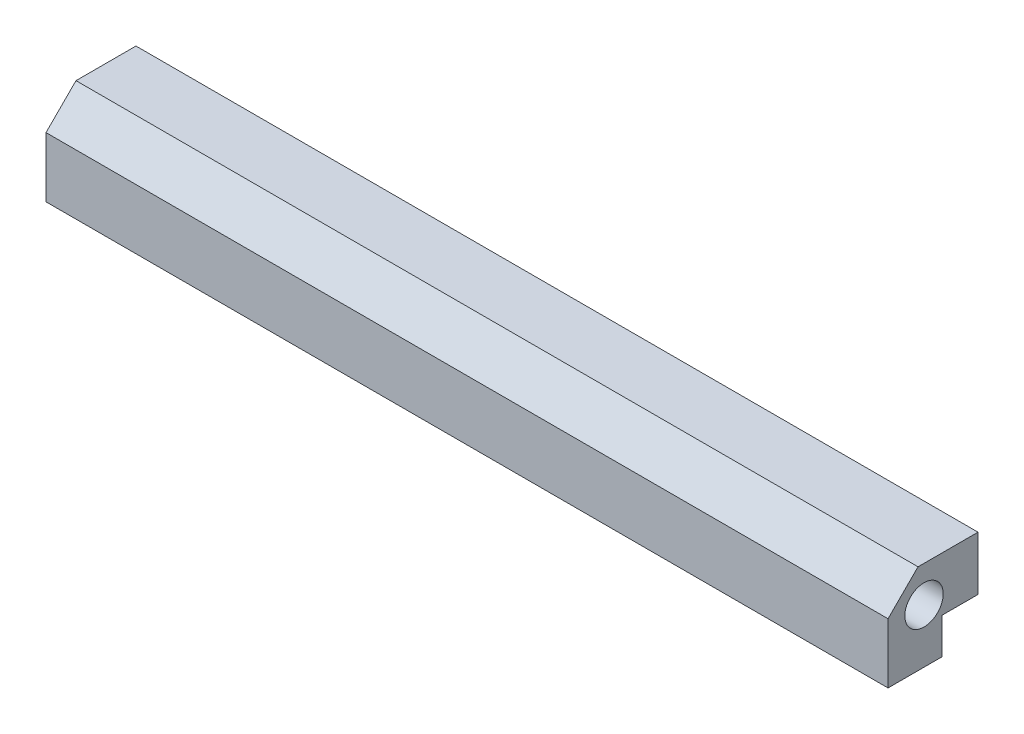
ISO-10303-21;
HEADER;
FILE_DESCRIPTION(('STEP AP214'),'2;1');
FILE_NAME('part.step','',(''),(''),'','','');
FILE_SCHEMA(('AUTOMOTIVE_DESIGN { 1 0 10303 214 1 1 1 1 }'));
ENDSEC;
DATA;
#1=APPLICATION_CONTEXT('core data for automotive mechanical design processes');
#2=APPLICATION_PROTOCOL_DEFINITION('international standard','automotive_design',2000,#1);
#3=PRODUCT_CONTEXT('',#1,'mechanical');
#4=PRODUCT('Part','Part','',(#3));
#5=PRODUCT_RELATED_PRODUCT_CATEGORY('part','',(#4));
#6=PRODUCT_DEFINITION_FORMATION('','',#4);
#7=PRODUCT_DEFINITION_CONTEXT('part definition',#1,'design');
#8=PRODUCT_DEFINITION('design','',#6,#7);
#9=PRODUCT_DEFINITION_SHAPE('','',#8);
#10=(LENGTH_UNIT() NAMED_UNIT(*) SI_UNIT(.MILLI.,.METRE.));
#11=(NAMED_UNIT(*) PLANE_ANGLE_UNIT() SI_UNIT($,.RADIAN.));
#12=(NAMED_UNIT(*) SI_UNIT($,.STERADIAN.) SOLID_ANGLE_UNIT());
#13=UNCERTAINTY_MEASURE_WITH_UNIT(LENGTH_MEASURE(1.E-05),#10,'distance_accuracy_value','');
#14=(GEOMETRIC_REPRESENTATION_CONTEXT(3) GLOBAL_UNCERTAINTY_ASSIGNED_CONTEXT((#13)) GLOBAL_UNIT_ASSIGNED_CONTEXT((#10,
#11,#12)) REPRESENTATION_CONTEXT('',''));
#15=CARTESIAN_POINT('',(0.,0.,0.));
#16=DIRECTION('',(0.,0.,1.));
#17=DIRECTION('',(1.,0.,0.));
#18=AXIS2_PLACEMENT_3D('',#15,#16,#17);
#19=CARTESIAN_POINT('',(70.2,-1.5,-1.5));
#20=DIRECTION('',(-1.,0.,0.));
#21=DIRECTION('',(0.,0.,1.));
#22=AXIS2_PLACEMENT_3D('',#19,#20,#21);
#23=CYLINDRICAL_SURFACE('',#22,2.35);
#24=CARTESIAN_POINT('',(-63.2,-1.5,-1.5));
#25=DIRECTION('',(-1.,0.,0.));
#26=DIRECTION('',(0.,0.,1.));
#27=AXIS2_PLACEMENT_3D('',#24,#25,#26);
#28=CIRCLE('',#27,2.35);
#29=CARTESIAN_POINT('',(-63.2,-1.5,0.85));
#30=VERTEX_POINT('',#29);
#31=EDGE_CURVE('E187',#30,#30,#28,.T.);
#32=ORIENTED_EDGE('',*,*,#31,.T.);
#33=EDGE_LOOP('',(#32));
#34=FACE_BOUND('',#33,.T.);
#35=CARTESIAN_POINT('',(63.2,-1.5,-1.5));
#36=DIRECTION('',(1.,0.,0.));
#37=DIRECTION('',(0.,0.,-1.));
#38=AXIS2_PLACEMENT_3D('',#35,#36,#37);
#39=CIRCLE('',#38,2.35);
#40=CARTESIAN_POINT('',(63.2,-1.5,-3.85));
#41=VERTEX_POINT('',#40);
#42=EDGE_CURVE('E199',#41,#41,#39,.T.);
#43=ORIENTED_EDGE('',*,*,#42,.T.);
#44=EDGE_LOOP('',(#43));
#45=FACE_BOUND('',#44,.T.);
#46=ADVANCED_FACE('F45',(#34,#45),#23,.F.);
#47=CARTESIAN_POINT('',(70.2,0.,0.));
#48=DIRECTION('',(-1.,0.,0.));
#49=DIRECTION('',(0.,0.,1.));
#50=AXIS2_PLACEMENT_3D('',#47,#48,#49);
#51=PLANE('',#50);
#52=CARTESIAN_POINT('',(70.2,-1.5,-1.5));
#53=DIRECTION('',(1.,0.,0.));
#54=DIRECTION('',(0.,0.,-1.));
#55=AXIS2_PLACEMENT_3D('',#52,#53,#54);
#56=CIRCLE('',#55,3.2);
#57=CARTESIAN_POINT('',(70.2,-1.5,-4.7));
#58=VERTEX_POINT('',#57);
#59=EDGE_CURVE('E195',#58,#58,#56,.T.);
#60=ORIENTED_EDGE('',*,*,#59,.F.);
#61=EDGE_LOOP('',(#60));
#62=FACE_BOUND('',#61,.T.);
#63=DIRECTION('',(0.,0.,1.));
#64=VECTOR('',#63,1.);
#65=CARTESIAN_POINT('',(70.2,4.5,4.5));
#66=LINE('',#65,#64);
#67=CARTESIAN_POINT('',(70.2,4.5,-10.5));
#68=VERTEX_POINT('',#67);
#69=CARTESIAN_POINT('',(70.2,4.5,-0.500000000000032));
#70=VERTEX_POINT('',#69);
#71=EDGE_CURVE('E175',#68,#70,#66,.T.);
#72=ORIENTED_EDGE('',*,*,#71,.T.);
#73=DIRECTION('',(0.,0.707106781186546,-0.707106781186549));
#74=VECTOR('',#73,1.);
#75=CARTESIAN_POINT('',(70.2,-0.500000000000004,4.5));
#76=LINE('',#75,#74);
#77=CARTESIAN_POINT('',(70.2,-0.500000000000004,4.5));
#78=VERTEX_POINT('',#77);
#79=EDGE_CURVE('E11',#70,#78,#76,.F.);
#80=ORIENTED_EDGE('',*,*,#79,.T.);
#81=DIRECTION('',(0.,-1.,0.));
#82=VECTOR('',#81,1.);
#83=CARTESIAN_POINT('',(70.2,-10.5,4.5));
#84=LINE('',#83,#82);
#85=CARTESIAN_POINT('',(70.2,-10.5,4.5));
#86=VERTEX_POINT('',#85);
#87=EDGE_CURVE('E123',#78,#86,#84,.T.);
#88=ORIENTED_EDGE('',*,*,#87,.T.);
#89=DIRECTION('',(0.,0.,-1.));
#90=VECTOR('',#89,1.);
#91=CARTESIAN_POINT('',(70.2,-10.5,-4.5));
#92=LINE('',#91,#90);
#93=CARTESIAN_POINT('',(70.2,-10.5,-4.5));
#94=VERTEX_POINT('',#93);
#95=EDGE_CURVE('E118',#86,#94,#92,.T.);
#96=ORIENTED_EDGE('',*,*,#95,.T.);
#97=DIRECTION('',(0.,1.,0.));
#98=VECTOR('',#97,1.);
#99=CARTESIAN_POINT('',(70.2,-4.5,-4.5));
#100=LINE('',#99,#98);
#101=CARTESIAN_POINT('',(70.2,-4.5,-4.5));
#102=VERTEX_POINT('',#101);
#103=EDGE_CURVE('E106',#94,#102,#100,.T.);
#104=ORIENTED_EDGE('',*,*,#103,.T.);
#105=DIRECTION('',(0.,0.,-1.));
#106=VECTOR('',#105,1.);
#107=CARTESIAN_POINT('',(70.2,-4.5,-10.5));
#108=LINE('',#107,#106);
#109=CARTESIAN_POINT('',(70.2,-4.5,-10.5));
#110=VERTEX_POINT('',#109);
#111=EDGE_CURVE('E117',#102,#110,#108,.T.);
#112=ORIENTED_EDGE('',*,*,#111,.T.);
#113=DIRECTION('',(0.,1.,0.));
#114=VECTOR('',#113,1.);
#115=CARTESIAN_POINT('',(70.2,4.5,-10.5));
#116=LINE('',#115,#114);
#117=EDGE_CURVE('E178',#110,#68,#116,.T.);
#118=ORIENTED_EDGE('',*,*,#117,.T.);
#119=EDGE_LOOP('',(#72,#80,#88,#96,#104,#112,#118));
#120=FACE_BOUND('',#119,.T.);
#121=ADVANCED_FACE('F121',(#62,#120),#51,.F.);
#122=CARTESIAN_POINT('',(-70.2,0.,0.));
#123=DIRECTION('',(-1.,0.,0.));
#124=DIRECTION('',(0.,0.,1.));
#125=AXIS2_PLACEMENT_3D('',#122,#123,#124);
#126=PLANE('',#125);
#127=CARTESIAN_POINT('',(-70.2,-1.5,-1.5));
#128=DIRECTION('',(-1.,0.,0.));
#129=DIRECTION('',(0.,0.,1.));
#130=AXIS2_PLACEMENT_3D('',#127,#128,#129);
#131=CIRCLE('',#130,3.2);
#132=CARTESIAN_POINT('',(-70.2,-1.5,1.7));
#133=VERTEX_POINT('',#132);
#134=EDGE_CURVE('E183',#133,#133,#131,.T.);
#135=ORIENTED_EDGE('',*,*,#134,.F.);
#136=EDGE_LOOP('',(#135));
#137=FACE_BOUND('',#136,.T.);
#138=DIRECTION('',(0.,-1.,0.));
#139=VECTOR('',#138,1.);
#140=CARTESIAN_POINT('',(-70.2,-10.5,4.5));
#141=LINE('',#140,#139);
#142=CARTESIAN_POINT('',(-70.2,-0.500000000000004,4.5));
#143=VERTEX_POINT('',#142);
#144=CARTESIAN_POINT('',(-70.2,-10.5,4.5));
#145=VERTEX_POINT('',#144);
#146=EDGE_CURVE('E128',#143,#145,#141,.T.);
#147=ORIENTED_EDGE('',*,*,#146,.F.);
#148=DIRECTION('',(0.,-0.707106781186546,0.707106781186549));
#149=VECTOR('',#148,1.);
#150=CARTESIAN_POINT('',(-70.2,2.,1.99999999999999));
#151=LINE('',#150,#149);
#152=CARTESIAN_POINT('',(-70.2,4.5,-0.500000000000032));
#153=VERTEX_POINT('',#152);
#154=EDGE_CURVE('E69',#143,#153,#151,.F.);
#155=ORIENTED_EDGE('',*,*,#154,.T.);
#156=DIRECTION('',(0.,0.,1.));
#157=VECTOR('',#156,1.);
#158=CARTESIAN_POINT('',(-70.2,4.5,4.5));
#159=LINE('',#158,#157);
#160=CARTESIAN_POINT('',(-70.2,4.5,-10.5));
#161=VERTEX_POINT('',#160);
#162=EDGE_CURVE('E158',#161,#153,#159,.T.);
#163=ORIENTED_EDGE('',*,*,#162,.F.);
#164=DIRECTION('',(0.,1.,0.));
#165=VECTOR('',#164,1.);
#166=CARTESIAN_POINT('',(-70.2,4.5,-10.5));
#167=LINE('',#166,#165);
#168=CARTESIAN_POINT('',(-70.2,-4.5,-10.5));
#169=VERTEX_POINT('',#168);
#170=EDGE_CURVE('E161',#169,#161,#167,.T.);
#171=ORIENTED_EDGE('',*,*,#170,.F.);
#172=DIRECTION('',(0.,0.,-1.));
#173=VECTOR('',#172,1.);
#174=CARTESIAN_POINT('',(-70.2,-4.5,-10.5));
#175=LINE('',#174,#173);
#176=CARTESIAN_POINT('',(-70.2,-4.5,-4.5));
#177=VERTEX_POINT('',#176);
#178=EDGE_CURVE('E164',#177,#169,#175,.T.);
#179=ORIENTED_EDGE('',*,*,#178,.F.);
#180=DIRECTION('',(0.,1.,0.));
#181=VECTOR('',#180,1.);
#182=CARTESIAN_POINT('',(-70.2,-4.5,-4.5));
#183=LINE('',#182,#181);
#184=CARTESIAN_POINT('',(-70.2,-10.5,-4.5));
#185=VERTEX_POINT('',#184);
#186=EDGE_CURVE('E167',#185,#177,#183,.T.);
#187=ORIENTED_EDGE('',*,*,#186,.F.);
#188=DIRECTION('',(0.,0.,-1.));
#189=VECTOR('',#188,1.);
#190=CARTESIAN_POINT('',(-70.2,-10.5,-4.5));
#191=LINE('',#190,#189);
#192=EDGE_CURVE('E132',#145,#185,#191,.T.);
#193=ORIENTED_EDGE('',*,*,#192,.F.);
#194=EDGE_LOOP('',(#147,#155,#163,#171,#179,#187,#193));
#195=FACE_BOUND('',#194,.T.);
#196=ADVANCED_FACE('F222',(#137,#195),#126,.T.);
#197=CARTESIAN_POINT('',(70.2,-10.5,-4.5));
#198=DIRECTION('',(0.,1.,0.));
#199=DIRECTION('',(0.,0.,1.));
#200=AXIS2_PLACEMENT_3D('',#197,#198,#199);
#201=PLANE('',#200);
#202=ORIENTED_EDGE('',*,*,#192,.T.);
#203=DIRECTION('',(-1.,0.,0.));
#204=VECTOR('',#203,1.);
#205=CARTESIAN_POINT('',(70.2,-10.5,-4.5));
#206=LINE('',#205,#204);
#207=EDGE_CURVE('E110',#94,#185,#206,.T.);
#208=ORIENTED_EDGE('',*,*,#207,.F.);
#209=ORIENTED_EDGE('',*,*,#95,.F.);
#210=DIRECTION('',(-1.,0.,0.));
#211=VECTOR('',#210,1.);
#212=CARTESIAN_POINT('',(70.2,-10.5,4.5));
#213=LINE('',#212,#211);
#214=EDGE_CURVE('E153',#86,#145,#213,.T.);
#215=ORIENTED_EDGE('',*,*,#214,.T.);
#216=EDGE_LOOP('',(#202,#208,#209,#215));
#217=FACE_BOUND('',#216,.T.);
#218=ADVANCED_FACE('F130',(#217),#201,.F.);
#219=CARTESIAN_POINT('',(70.2,-4.5,-4.5));
#220=DIRECTION('',(0.,0.,1.));
#221=DIRECTION('',(1.,0.,0.));
#222=AXIS2_PLACEMENT_3D('',#219,#220,#221);
#223=PLANE('',#222);
#224=ORIENTED_EDGE('',*,*,#186,.T.);
#225=DIRECTION('',(-1.,0.,0.));
#226=VECTOR('',#225,1.);
#227=CARTESIAN_POINT('',(70.2,-4.5,-4.5));
#228=LINE('',#227,#226);
#229=EDGE_CURVE('E113',#102,#177,#228,.T.);
#230=ORIENTED_EDGE('',*,*,#229,.F.);
#231=ORIENTED_EDGE('',*,*,#103,.F.);
#232=ORIENTED_EDGE('',*,*,#207,.T.);
#233=EDGE_LOOP('',(#224,#230,#231,#232));
#234=FACE_BOUND('',#233,.T.);
#235=ADVANCED_FACE('F108',(#234),#223,.F.);
#236=CARTESIAN_POINT('',(70.2,-4.5,-10.5));
#237=DIRECTION('',(0.,1.,0.));
#238=DIRECTION('',(0.,0.,1.));
#239=AXIS2_PLACEMENT_3D('',#236,#237,#238);
#240=PLANE('',#239);
#241=ORIENTED_EDGE('',*,*,#178,.T.);
#242=DIRECTION('',(-1.,0.,0.));
#243=VECTOR('',#242,1.);
#244=CARTESIAN_POINT('',(70.2,-4.5,-10.5));
#245=LINE('',#244,#243);
#246=EDGE_CURVE('E140',#110,#169,#245,.T.);
#247=ORIENTED_EDGE('',*,*,#246,.F.);
#248=ORIENTED_EDGE('',*,*,#111,.F.);
#249=ORIENTED_EDGE('',*,*,#229,.T.);
#250=EDGE_LOOP('',(#241,#247,#248,#249));
#251=FACE_BOUND('',#250,.T.);
#252=ADVANCED_FACE('F244',(#251),#240,.F.);
#253=CARTESIAN_POINT('',(70.2,4.5,-10.5));
#254=DIRECTION('',(0.,0.,1.));
#255=DIRECTION('',(0.,-1.,0.));
#256=AXIS2_PLACEMENT_3D('',#253,#254,#255);
#257=PLANE('',#256);
#258=ORIENTED_EDGE('',*,*,#170,.T.);
#259=DIRECTION('',(-1.,0.,0.));
#260=VECTOR('',#259,1.);
#261=CARTESIAN_POINT('',(70.2,4.5,-10.5));
#262=LINE('',#261,#260);
#263=EDGE_CURVE('E149',#68,#161,#262,.T.);
#264=ORIENTED_EDGE('',*,*,#263,.F.);
#265=ORIENTED_EDGE('',*,*,#117,.F.);
#266=ORIENTED_EDGE('',*,*,#246,.T.);
#267=EDGE_LOOP('',(#258,#264,#265,#266));
#268=FACE_BOUND('',#267,.T.);
#269=ADVANCED_FACE('F241',(#268),#257,.F.);
#270=CARTESIAN_POINT('',(70.2,4.5,4.5));
#271=DIRECTION('',(0.,-1.,0.));
#272=DIRECTION('',(0.,0.,-1.));
#273=AXIS2_PLACEMENT_3D('',#270,#271,#272);
#274=PLANE('',#273);
#275=ORIENTED_EDGE('',*,*,#162,.T.);
#276=DIRECTION('',(1.,0.,0.));
#277=VECTOR('',#276,1.);
#278=CARTESIAN_POINT('',(70.2,4.5,-0.500000000000032));
#279=LINE('',#278,#277);
#280=EDGE_CURVE('E55',#153,#70,#279,.T.);
#281=ORIENTED_EDGE('',*,*,#280,.T.);
#282=ORIENTED_EDGE('',*,*,#71,.F.);
#283=ORIENTED_EDGE('',*,*,#263,.T.);
#284=EDGE_LOOP('',(#275,#281,#282,#283));
#285=FACE_BOUND('',#284,.T.);
#286=ADVANCED_FACE('F237',(#285),#274,.F.);
#287=CARTESIAN_POINT('',(70.2,-10.5,4.5));
#288=DIRECTION('',(0.,0.,-1.));
#289=DIRECTION('',(0.,1.,0.));
#290=AXIS2_PLACEMENT_3D('',#287,#288,#289);
#291=PLANE('',#290);
#292=ORIENTED_EDGE('',*,*,#87,.F.);
#293=DIRECTION('',(-1.,0.,0.));
#294=VECTOR('',#293,1.);
#295=CARTESIAN_POINT('',(70.2,-0.500000000000004,4.5));
#296=LINE('',#295,#294);
#297=EDGE_CURVE('E134',#78,#143,#296,.T.);
#298=ORIENTED_EDGE('',*,*,#297,.T.);
#299=ORIENTED_EDGE('',*,*,#146,.T.);
#300=ORIENTED_EDGE('',*,*,#214,.F.);
#301=EDGE_LOOP('',(#292,#298,#299,#300));
#302=FACE_BOUND('',#301,.T.);
#303=ADVANCED_FACE('F234',(#302),#291,.F.);
#304=CARTESIAN_POINT('',(70.2,-0.500000000000004,4.5));
#305=DIRECTION('',(0.,-0.707106781186549,-0.707106781186545));
#306=DIRECTION('',(-1.,0.,0.));
#307=AXIS2_PLACEMENT_3D('',#304,#305,#306);
#308=PLANE('',#307);
#309=ORIENTED_EDGE('',*,*,#79,.F.);
#310=ORIENTED_EDGE('',*,*,#280,.F.);
#311=ORIENTED_EDGE('',*,*,#154,.F.);
#312=ORIENTED_EDGE('',*,*,#297,.F.);
#313=EDGE_LOOP('',(#309,#310,#311,#312));
#314=FACE_BOUND('',#313,.T.);
#315=ADVANCED_FACE('F48',(#314),#308,.F.);
#316=CARTESIAN_POINT('',(-63.2,-1.5,-1.5));
#317=DIRECTION('',(-1.,0.,0.));
#318=DIRECTION('',(0.,0.,1.));
#319=AXIS2_PLACEMENT_3D('',#316,#317,#318);
#320=CYLINDRICAL_SURFACE('',#319,3.2);
#321=CARTESIAN_POINT('',(-63.2,-1.5,-1.5));
#322=DIRECTION('',(-1.,0.,0.));
#323=DIRECTION('',(0.,0.,1.));
#324=AXIS2_PLACEMENT_3D('',#321,#322,#323);
#325=CIRCLE('',#324,3.2);
#326=CARTESIAN_POINT('',(-63.2,-1.5,1.7));
#327=VERTEX_POINT('',#326);
#328=EDGE_CURVE('E172',#327,#327,#325,.T.);
#329=ORIENTED_EDGE('',*,*,#328,.F.);
#330=EDGE_LOOP('',(#329));
#331=FACE_BOUND('',#330,.T.);
#332=ORIENTED_EDGE('',*,*,#134,.T.);
#333=EDGE_LOOP('',(#332));
#334=FACE_BOUND('',#333,.T.);
#335=ADVANCED_FACE('F281',(#331,#334),#320,.F.);
#336=CARTESIAN_POINT('',(-63.2,-1.5,-1.5));
#337=DIRECTION('',(-1.,0.,0.));
#338=DIRECTION('',(0.,0.,1.));
#339=AXIS2_PLACEMENT_3D('',#336,#337,#338);
#340=PLANE('',#339);
#341=ORIENTED_EDGE('',*,*,#31,.F.);
#342=EDGE_LOOP('',(#341));
#343=FACE_BOUND('',#342,.T.);
#344=ORIENTED_EDGE('',*,*,#328,.T.);
#345=EDGE_LOOP('',(#344));
#346=FACE_BOUND('',#345,.T.);
#347=ADVANCED_FACE('F217',(#343,#346),#340,.T.);
#348=CARTESIAN_POINT('',(63.2,-1.5,-1.5));
#349=DIRECTION('',(1.,0.,0.));
#350=DIRECTION('',(0.,0.,-1.));
#351=AXIS2_PLACEMENT_3D('',#348,#349,#350);
#352=CYLINDRICAL_SURFACE('',#351,3.2);
#353=CARTESIAN_POINT('',(63.2,-1.5,-1.5));
#354=DIRECTION('',(1.,0.,0.));
#355=DIRECTION('',(0.,0.,-1.));
#356=AXIS2_PLACEMENT_3D('',#353,#354,#355);
#357=CIRCLE('',#356,3.2);
#358=CARTESIAN_POINT('',(63.2,-1.5,-4.7));
#359=VERTEX_POINT('',#358);
#360=EDGE_CURVE('E194',#359,#359,#357,.T.);
#361=ORIENTED_EDGE('',*,*,#360,.F.);
#362=EDGE_LOOP('',(#361));
#363=FACE_BOUND('',#362,.T.);
#364=ORIENTED_EDGE('',*,*,#59,.T.);
#365=EDGE_LOOP('',(#364));
#366=FACE_BOUND('',#365,.T.);
#367=ADVANCED_FACE('F211',(#363,#366),#352,.F.);
#368=CARTESIAN_POINT('',(63.2,-1.5,-1.5));
#369=DIRECTION('',(1.,0.,0.));
#370=DIRECTION('',(0.,0.,-1.));
#371=AXIS2_PLACEMENT_3D('',#368,#369,#370);
#372=PLANE('',#371);
#373=ORIENTED_EDGE('',*,*,#42,.F.);
#374=EDGE_LOOP('',(#373));
#375=FACE_BOUND('',#374,.T.);
#376=ORIENTED_EDGE('',*,*,#360,.T.);
#377=EDGE_LOOP('',(#376));
#378=FACE_BOUND('',#377,.T.);
#379=ADVANCED_FACE('F208',(#375,#378),#372,.T.);
#380=CLOSED_SHELL('',(#46,#121,#196,#218,#235,#252,#269,#286,#303,#315,#335,#347,#367,#379));
#381=MANIFOLD_SOLID_BREP('B2',#380);
#382=ADVANCED_BREP_SHAPE_REPRESENTATION('',(#18,#381),#14);
#383=SHAPE_DEFINITION_REPRESENTATION(#9,#382);
ENDSEC;
END-ISO-10303-21;
